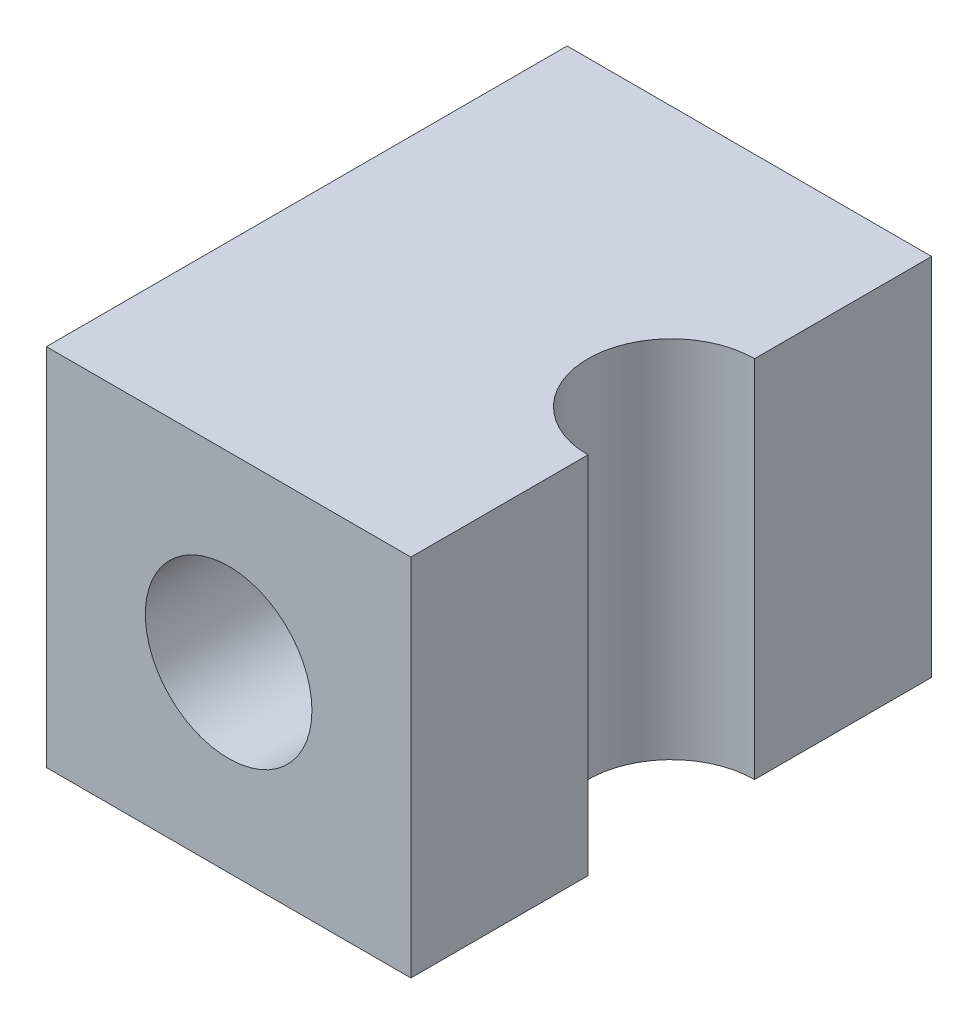
ISO-10303-21;
HEADER;
FILE_DESCRIPTION(('STEP AP214'),'2;1');
FILE_NAME('part.step','',(''),(''),'','','');
FILE_SCHEMA(('AUTOMOTIVE_DESIGN { 1 0 10303 214 1 1 1 1 }'));
ENDSEC;
DATA;
#1=APPLICATION_CONTEXT('core data for automotive mechanical design processes');
#2=APPLICATION_PROTOCOL_DEFINITION('international standard','automotive_design',2000,#1);
#3=PRODUCT_CONTEXT('',#1,'mechanical');
#4=PRODUCT('Part','Part','',(#3));
#5=PRODUCT_RELATED_PRODUCT_CATEGORY('part','',(#4));
#6=PRODUCT_DEFINITION_FORMATION('','',#4);
#7=PRODUCT_DEFINITION_CONTEXT('part definition',#1,'design');
#8=PRODUCT_DEFINITION('design','',#6,#7);
#9=PRODUCT_DEFINITION_SHAPE('','',#8);
#10=(LENGTH_UNIT() NAMED_UNIT(*) SI_UNIT(.MILLI.,.METRE.));
#11=(NAMED_UNIT(*) PLANE_ANGLE_UNIT() SI_UNIT($,.RADIAN.));
#12=(NAMED_UNIT(*) SI_UNIT($,.STERADIAN.) SOLID_ANGLE_UNIT());
#13=UNCERTAINTY_MEASURE_WITH_UNIT(LENGTH_MEASURE(1.E-05),#10,'distance_accuracy_value','');
#14=(GEOMETRIC_REPRESENTATION_CONTEXT(3) GLOBAL_UNCERTAINTY_ASSIGNED_CONTEXT((#13)) GLOBAL_UNIT_ASSIGNED_CONTEXT((#10,
#11,#12)) REPRESENTATION_CONTEXT('',''));
#15=CARTESIAN_POINT('',(0.,0.,0.));
#16=DIRECTION('',(0.,0.,1.));
#17=DIRECTION('',(1.,0.,0.));
#18=AXIS2_PLACEMENT_3D('',#15,#16,#17);
#19=CARTESIAN_POINT('',(3.5,3.5,5.));
#20=DIRECTION('',(-1.,0.,0.));
#21=DIRECTION('',(0.,-1.,0.));
#22=AXIS2_PLACEMENT_3D('',#19,#20,#21);
#23=PLANE('',#22);
#24=DIRECTION('',(0.,0.,-1.));
#25=VECTOR('',#24,1.);
#26=CARTESIAN_POINT('',(3.5,-3.5,5.));
#27=LINE('',#26,#25);
#28=CARTESIAN_POINT('',(3.5,-3.5,5.));
#29=VERTEX_POINT('',#28);
#30=CARTESIAN_POINT('',(3.5,-3.5,1.6));
#31=VERTEX_POINT('',#30);
#32=EDGE_CURVE('E109',#29,#31,#27,.T.);
#33=ORIENTED_EDGE('',*,*,#32,.T.);
#34=DIRECTION('',(0.,1.,0.));
#35=VECTOR('',#34,1.);
#36=CARTESIAN_POINT('',(3.5,-3.5,1.6));
#37=LINE('',#36,#35);
#38=CARTESIAN_POINT('',(3.5,3.5,1.6));
#39=VERTEX_POINT('',#38);
#40=EDGE_CURVE('E50',#31,#39,#37,.T.);
#41=ORIENTED_EDGE('',*,*,#40,.T.);
#42=DIRECTION('',(0.,0.,-1.));
#43=VECTOR('',#42,1.);
#44=CARTESIAN_POINT('',(3.5,3.5,5.));
#45=LINE('',#44,#43);
#46=CARTESIAN_POINT('',(3.5,3.5,5.));
#47=VERTEX_POINT('',#46);
#48=EDGE_CURVE('E43',#47,#39,#45,.T.);
#49=ORIENTED_EDGE('',*,*,#48,.F.);
#50=DIRECTION('',(0.,1.,0.));
#51=VECTOR('',#50,1.);
#52=CARTESIAN_POINT('',(3.5,3.5,5.));
#53=LINE('',#52,#51);
#54=EDGE_CURVE('E139',#29,#47,#53,.T.);
#55=ORIENTED_EDGE('',*,*,#54,.F.);
#56=EDGE_LOOP('',(#33,#41,#49,#55));
#57=FACE_BOUND('',#56,.T.);
#58=ADVANCED_FACE('F35',(#57),#23,.F.);
#59=CARTESIAN_POINT('',(0.,0.,5.));
#60=DIRECTION('',(0.,0.,1.));
#61=DIRECTION('',(1.,0.,0.));
#62=AXIS2_PLACEMENT_3D('',#59,#60,#61);
#63=PLANE('',#62);
#64=ORIENTED_EDGE('',*,*,#54,.T.);
#65=DIRECTION('',(-1.,0.,0.));
#66=VECTOR('',#65,1.);
#67=CARTESIAN_POINT('',(-3.5,3.5,5.));
#68=LINE('',#67,#66);
#69=CARTESIAN_POINT('',(-3.5,3.5,5.));
#70=VERTEX_POINT('',#69);
#71=EDGE_CURVE('E88',#47,#70,#68,.T.);
#72=ORIENTED_EDGE('',*,*,#71,.T.);
#73=DIRECTION('',(0.,-1.,0.));
#74=VECTOR('',#73,1.);
#75=CARTESIAN_POINT('',(-3.5,3.5,5.));
#76=LINE('',#75,#74);
#77=CARTESIAN_POINT('',(-3.5,-3.5,5.));
#78=VERTEX_POINT('',#77);
#79=EDGE_CURVE('E112',#70,#78,#76,.T.);
#80=ORIENTED_EDGE('',*,*,#79,.T.);
#81=DIRECTION('',(1.,0.,0.));
#82=VECTOR('',#81,1.);
#83=CARTESIAN_POINT('',(-3.5,-3.5,5.));
#84=LINE('',#83,#82);
#85=EDGE_CURVE('E58',#78,#29,#84,.T.);
#86=ORIENTED_EDGE('',*,*,#85,.T.);
#87=EDGE_LOOP('',(#64,#72,#80,#86));
#88=FACE_BOUND('',#87,.T.);
#89=CARTESIAN_POINT('',(0.,0.,5.));
#90=DIRECTION('',(0.,0.,1.));
#91=DIRECTION('',(1.,0.,0.));
#92=AXIS2_PLACEMENT_3D('',#89,#90,#91);
#93=CIRCLE('',#92,1.6);
#94=CARTESIAN_POINT('',(1.6,0.,5.));
#95=VERTEX_POINT('',#94);
#96=EDGE_CURVE('E131',#95,#95,#93,.T.);
#97=ORIENTED_EDGE('',*,*,#96,.F.);
#98=EDGE_LOOP('',(#97));
#99=FACE_BOUND('',#98,.T.);
#100=ADVANCED_FACE('F145',(#88,#99),#63,.T.);
#101=CARTESIAN_POINT('',(0.,0.,-5.));
#102=DIRECTION('',(0.,0.,1.));
#103=DIRECTION('',(1.,0.,0.));
#104=AXIS2_PLACEMENT_3D('',#101,#102,#103);
#105=PLANE('',#104);
#106=DIRECTION('',(0.,1.,0.));
#107=VECTOR('',#106,1.);
#108=CARTESIAN_POINT('',(3.5,3.5,-5.));
#109=LINE('',#108,#107);
#110=CARTESIAN_POINT('',(3.5,-3.5,-5.));
#111=VERTEX_POINT('',#110);
#112=CARTESIAN_POINT('',(3.5,3.5,-5.));
#113=VERTEX_POINT('',#112);
#114=EDGE_CURVE('E128',#111,#113,#109,.T.);
#115=ORIENTED_EDGE('',*,*,#114,.F.);
#116=DIRECTION('',(1.,0.,0.));
#117=VECTOR('',#116,1.);
#118=CARTESIAN_POINT('',(-3.5,-3.5,-5.));
#119=LINE('',#118,#117);
#120=CARTESIAN_POINT('',(-3.5,-3.5,-5.));
#121=VERTEX_POINT('',#120);
#122=EDGE_CURVE('E107',#121,#111,#119,.T.);
#123=ORIENTED_EDGE('',*,*,#122,.F.);
#124=DIRECTION('',(0.,-1.,0.));
#125=VECTOR('',#124,1.);
#126=CARTESIAN_POINT('',(-3.5,3.5,-5.));
#127=LINE('',#126,#125);
#128=CARTESIAN_POINT('',(-3.5,3.5,-5.));
#129=VERTEX_POINT('',#128);
#130=EDGE_CURVE('E129',#129,#121,#127,.T.);
#131=ORIENTED_EDGE('',*,*,#130,.F.);
#132=DIRECTION('',(-1.,0.,0.));
#133=VECTOR('',#132,1.);
#134=CARTESIAN_POINT('',(-3.5,3.5,-5.));
#135=LINE('',#134,#133);
#136=EDGE_CURVE('E123',#113,#129,#135,.T.);
#137=ORIENTED_EDGE('',*,*,#136,.F.);
#138=EDGE_LOOP('',(#115,#123,#131,#137));
#139=FACE_BOUND('',#138,.T.);
#140=CARTESIAN_POINT('',(0.,0.,-5.));
#141=DIRECTION('',(0.,0.,1.));
#142=DIRECTION('',(1.,0.,0.));
#143=AXIS2_PLACEMENT_3D('',#140,#141,#142);
#144=CIRCLE('',#143,1.6);
#145=CARTESIAN_POINT('',(1.6,0.,-5.));
#146=VERTEX_POINT('',#145);
#147=EDGE_CURVE('E134',#146,#146,#144,.T.);
#148=ORIENTED_EDGE('',*,*,#147,.T.);
#149=EDGE_LOOP('',(#148));
#150=FACE_BOUND('',#149,.T.);
#151=ADVANCED_FACE('F126',(#139,#150),#105,.F.);
#152=CARTESIAN_POINT('',(3.5,3.5,-1.6));
#153=VERTEX_POINT('',#152);
#154=EDGE_CURVE('E101',#153,#113,#45,.T.);
#155=ORIENTED_EDGE('',*,*,#154,.F.);
#156=DIRECTION('',(0.,1.,0.));
#157=VECTOR('',#156,1.);
#158=CARTESIAN_POINT('',(3.5,-3.5,-1.6));
#159=LINE('',#158,#157);
#160=CARTESIAN_POINT('',(3.5,-3.5,-1.6));
#161=VERTEX_POINT('',#160);
#162=EDGE_CURVE('E96',#153,#161,#159,.F.);
#163=ORIENTED_EDGE('',*,*,#162,.T.);
#164=EDGE_CURVE('E80',#161,#111,#27,.T.);
#165=ORIENTED_EDGE('',*,*,#164,.T.);
#166=ORIENTED_EDGE('',*,*,#114,.T.);
#167=EDGE_LOOP('',(#155,#163,#165,#166));
#168=FACE_BOUND('',#167,.T.);
#169=ADVANCED_FACE('F37',(#168),#23,.F.);
#170=CARTESIAN_POINT('',(-3.5,3.5,5.));
#171=DIRECTION('',(0.,-1.,0.));
#172=DIRECTION('',(0.,0.,-1.));
#173=AXIS2_PLACEMENT_3D('',#170,#171,#172);
#174=PLANE('',#173);
#175=ORIENTED_EDGE('',*,*,#48,.T.);
#176=CARTESIAN_POINT('',(3.5,3.5,0.));
#177=DIRECTION('',(0.,1.,0.));
#178=DIRECTION('',(0.,0.,1.));
#179=AXIS2_PLACEMENT_3D('',#176,#177,#178);
#180=CIRCLE('',#179,1.6);
#181=EDGE_CURVE('E102',#153,#39,#180,.T.);
#182=ORIENTED_EDGE('',*,*,#181,.F.);
#183=ORIENTED_EDGE('',*,*,#154,.T.);
#184=ORIENTED_EDGE('',*,*,#136,.T.);
#185=DIRECTION('',(0.,0.,-1.));
#186=VECTOR('',#185,1.);
#187=CARTESIAN_POINT('',(-3.5,3.5,5.));
#188=LINE('',#187,#186);
#189=EDGE_CURVE('E118',#70,#129,#188,.T.);
#190=ORIENTED_EDGE('',*,*,#189,.F.);
#191=ORIENTED_EDGE('',*,*,#71,.F.);
#192=EDGE_LOOP('',(#175,#182,#183,#184,#190,#191));
#193=FACE_BOUND('',#192,.T.);
#194=ADVANCED_FACE('F122',(#193),#174,.F.);
#195=CARTESIAN_POINT('',(-3.5,3.5,5.));
#196=DIRECTION('',(1.,0.,0.));
#197=DIRECTION('',(0.,0.,-1.));
#198=AXIS2_PLACEMENT_3D('',#195,#196,#197);
#199=PLANE('',#198);
#200=ORIENTED_EDGE('',*,*,#130,.T.);
#201=DIRECTION('',(0.,0.,-1.));
#202=VECTOR('',#201,1.);
#203=CARTESIAN_POINT('',(-3.5,-3.5,5.));
#204=LINE('',#203,#202);
#205=EDGE_CURVE('E111',#78,#121,#204,.T.);
#206=ORIENTED_EDGE('',*,*,#205,.F.);
#207=ORIENTED_EDGE('',*,*,#79,.F.);
#208=ORIENTED_EDGE('',*,*,#189,.T.);
#209=EDGE_LOOP('',(#200,#206,#207,#208));
#210=FACE_BOUND('',#209,.T.);
#211=ADVANCED_FACE('F147',(#210),#199,.F.);
#212=CARTESIAN_POINT('',(-3.5,-3.5,5.));
#213=DIRECTION('',(0.,1.,0.));
#214=DIRECTION('',(-1.,0.,0.));
#215=AXIS2_PLACEMENT_3D('',#212,#213,#214);
#216=PLANE('',#215);
#217=ORIENTED_EDGE('',*,*,#164,.F.);
#218=CARTESIAN_POINT('',(3.5,-3.5,0.));
#219=DIRECTION('',(0.,1.,0.));
#220=DIRECTION('',(-1.,0.,0.));
#221=AXIS2_PLACEMENT_3D('',#218,#219,#220);
#222=CIRCLE('',#221,1.6);
#223=EDGE_CURVE('E11',#161,#31,#222,.T.);
#224=ORIENTED_EDGE('',*,*,#223,.T.);
#225=ORIENTED_EDGE('',*,*,#32,.F.);
#226=ORIENTED_EDGE('',*,*,#85,.F.);
#227=ORIENTED_EDGE('',*,*,#205,.T.);
#228=ORIENTED_EDGE('',*,*,#122,.T.);
#229=EDGE_LOOP('',(#217,#224,#225,#226,#227,#228));
#230=FACE_BOUND('',#229,.T.);
#231=ADVANCED_FACE('F104',(#230),#216,.F.);
#232=CARTESIAN_POINT('',(0.,0.,5.));
#233=DIRECTION('',(0.,0.,-1.));
#234=DIRECTION('',(-1.,0.,0.));
#235=AXIS2_PLACEMENT_3D('',#232,#233,#234);
#236=CYLINDRICAL_SURFACE('',#235,1.6);
#237=ORIENTED_EDGE('',*,*,#96,.T.);
#238=EDGE_LOOP('',(#237));
#239=FACE_BOUND('',#238,.T.);
#240=ORIENTED_EDGE('',*,*,#147,.F.);
#241=EDGE_LOOP('',(#240));
#242=FACE_BOUND('',#241,.T.);
#243=ADVANCED_FACE('F154',(#239,#242),#236,.F.);
#244=CARTESIAN_POINT('',(3.5,-3.5,0.));
#245=DIRECTION('',(0.,1.,0.));
#246=DIRECTION('',(0.,0.,1.));
#247=AXIS2_PLACEMENT_3D('',#244,#245,#246);
#248=CYLINDRICAL_SURFACE('',#247,1.6);
#249=ORIENTED_EDGE('',*,*,#223,.F.);
#250=ORIENTED_EDGE('',*,*,#162,.F.);
#251=ORIENTED_EDGE('',*,*,#181,.T.);
#252=ORIENTED_EDGE('',*,*,#40,.F.);
#253=EDGE_LOOP('',(#249,#250,#251,#252));
#254=FACE_BOUND('',#253,.T.);
#255=ADVANCED_FACE('F95',(#254),#248,.F.);
#256=CLOSED_SHELL('',(#58,#100,#151,#169,#194,#211,#231,#243,#255));
#257=MANIFOLD_SOLID_BREP('B2',#256);
#258=ADVANCED_BREP_SHAPE_REPRESENTATION('',(#18,#257),#14);
#259=SHAPE_DEFINITION_REPRESENTATION(#9,#258);
ENDSEC;
END-ISO-10303-21;
